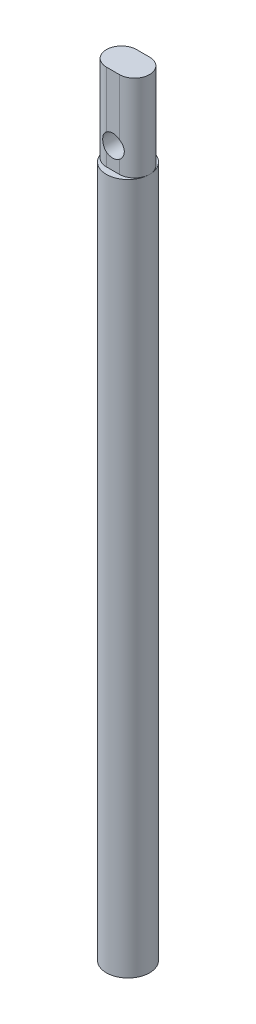
ISO-10303-21;
HEADER;
FILE_DESCRIPTION(('STEP AP214'),'2;1');
FILE_NAME('part.step','',(''),(''),'','','');
FILE_SCHEMA(('AUTOMOTIVE_DESIGN { 1 0 10303 214 1 1 1 1 }'));
ENDSEC;
DATA;
#1=APPLICATION_CONTEXT('core data for automotive mechanical design processes');
#2=APPLICATION_PROTOCOL_DEFINITION('international standard','automotive_design',2000,#1);
#3=PRODUCT_CONTEXT('',#1,'mechanical');
#4=PRODUCT('Part','Part','',(#3));
#5=PRODUCT_RELATED_PRODUCT_CATEGORY('part','',(#4));
#6=PRODUCT_DEFINITION_FORMATION('','',#4);
#7=PRODUCT_DEFINITION_CONTEXT('part definition',#1,'design');
#8=PRODUCT_DEFINITION('design','',#6,#7);
#9=PRODUCT_DEFINITION_SHAPE('','',#8);
#10=(LENGTH_UNIT() NAMED_UNIT(*) SI_UNIT(.MILLI.,.METRE.));
#11=(NAMED_UNIT(*) PLANE_ANGLE_UNIT() SI_UNIT($,.RADIAN.));
#12=(NAMED_UNIT(*) SI_UNIT($,.STERADIAN.) SOLID_ANGLE_UNIT());
#13=UNCERTAINTY_MEASURE_WITH_UNIT(LENGTH_MEASURE(1.E-05),#10,'distance_accuracy_value','');
#14=(GEOMETRIC_REPRESENTATION_CONTEXT(3) GLOBAL_UNCERTAINTY_ASSIGNED_CONTEXT((#13)) GLOBAL_UNIT_ASSIGNED_CONTEXT((#10,
#11,#12)) REPRESENTATION_CONTEXT('',''));
#15=CARTESIAN_POINT('',(0.,0.,0.));
#16=DIRECTION('',(0.,0.,1.));
#17=DIRECTION('',(1.,0.,0.));
#18=AXIS2_PLACEMENT_3D('',#15,#16,#17);
#19=CARTESIAN_POINT('',(1.5,180.,-3.5));
#20=DIRECTION('',(0.,0.,1.));
#21=DIRECTION('',(1.,0.,0.));
#22=AXIS2_PLACEMENT_3D('',#19,#20,#21);
#23=PLANE('',#22);
#24=DIRECTION('',(0.,-1.,0.));
#25=VECTOR('',#24,1.);
#26=CARTESIAN_POINT('',(1.5,180.,-3.5));
#27=LINE('',#26,#25);
#28=CARTESIAN_POINT('',(1.5,180.,-3.5));
#29=VERTEX_POINT('',#28);
#30=CARTESIAN_POINT('',(1.5,167.,-3.5));
#31=VERTEX_POINT('',#30);
#32=EDGE_CURVE('E153',#29,#31,#27,.T.);
#33=ORIENTED_EDGE('',*,*,#32,.T.);
#34=CARTESIAN_POINT('',(0.,165.,-3.5));
#35=DIRECTION('',(0.,0.,1.));
#36=DIRECTION('',(1.,0.,0.));
#37=AXIS2_PLACEMENT_3D('',#34,#35,#36);
#38=CIRCLE('',#37,2.5);
#39=CARTESIAN_POINT('',(-1.5,167.,-3.5));
#40=VERTEX_POINT('',#39);
#41=EDGE_CURVE('E250',#31,#40,#38,.T.);
#42=ORIENTED_EDGE('',*,*,#41,.T.);
#43=DIRECTION('',(0.,-1.,0.));
#44=VECTOR('',#43,1.);
#45=CARTESIAN_POINT('',(-1.5,180.,-3.5));
#46=LINE('',#45,#44);
#47=CARTESIAN_POINT('',(-1.5,180.,-3.5));
#48=VERTEX_POINT('',#47);
#49=EDGE_CURVE('E148',#48,#40,#46,.T.);
#50=ORIENTED_EDGE('',*,*,#49,.F.);
#51=DIRECTION('',(-1.,0.,0.));
#52=VECTOR('',#51,1.);
#53=CARTESIAN_POINT('',(1.5,180.,-3.5));
#54=LINE('',#53,#52);
#55=EDGE_CURVE('E200',#29,#48,#54,.T.);
#56=ORIENTED_EDGE('',*,*,#55,.F.);
#57=EDGE_LOOP('',(#33,#42,#50,#56));
#58=FACE_BOUND('',#57,.T.);
#59=ADVANCED_FACE('F39',(#58),#23,.F.);
#60=CARTESIAN_POINT('',(1.5,180.,3.5));
#61=DIRECTION('',(0.,0.,-1.));
#62=DIRECTION('',(-1.,0.,0.));
#63=AXIS2_PLACEMENT_3D('',#60,#61,#62);
#64=PLANE('',#63);
#65=DIRECTION('',(0.,-1.,0.));
#66=VECTOR('',#65,1.);
#67=CARTESIAN_POINT('',(-1.5,180.,3.5));
#68=LINE('',#67,#66);
#69=CARTESIAN_POINT('',(-1.5,180.,3.5));
#70=VERTEX_POINT('',#69);
#71=CARTESIAN_POINT('',(-1.5,167.,3.5));
#72=VERTEX_POINT('',#71);
#73=EDGE_CURVE('E127',#70,#72,#68,.T.);
#74=ORIENTED_EDGE('',*,*,#73,.T.);
#75=CARTESIAN_POINT('',(0.,165.,3.5));
#76=DIRECTION('',(0.,0.,1.));
#77=DIRECTION('',(1.,0.,0.));
#78=AXIS2_PLACEMENT_3D('',#75,#76,#77);
#79=CIRCLE('',#78,2.5);
#80=CARTESIAN_POINT('',(1.5,167.,3.5));
#81=VERTEX_POINT('',#80);
#82=EDGE_CURVE('E111',#81,#72,#79,.T.);
#83=ORIENTED_EDGE('',*,*,#82,.F.);
#84=DIRECTION('',(0.,-1.,0.));
#85=VECTOR('',#84,1.);
#86=CARTESIAN_POINT('',(1.5,180.,3.5));
#87=LINE('',#86,#85);
#88=CARTESIAN_POINT('',(1.5,180.,3.5));
#89=VERTEX_POINT('',#88);
#90=EDGE_CURVE('E124',#89,#81,#87,.T.);
#91=ORIENTED_EDGE('',*,*,#90,.F.);
#92=DIRECTION('',(1.,0.,0.));
#93=VECTOR('',#92,1.);
#94=CARTESIAN_POINT('',(1.5,180.,3.5));
#95=LINE('',#94,#93);
#96=EDGE_CURVE('E141',#70,#89,#95,.T.);
#97=ORIENTED_EDGE('',*,*,#96,.F.);
#98=EDGE_LOOP('',(#74,#83,#91,#97));
#99=FACE_BOUND('',#98,.T.);
#100=ADVANCED_FACE('F122',(#99),#64,.F.);
#101=CARTESIAN_POINT('',(0.,160.,0.));
#102=DIRECTION('',(0.,1.,0.));
#103=DIRECTION('',(0.,0.,1.));
#104=AXIS2_PLACEMENT_3D('',#101,#102,#103);
#105=PLANE('',#104);
#106=DIRECTION('',(1.,0.,0.));
#107=VECTOR('',#106,1.);
#108=CARTESIAN_POINT('',(1.5,160.,3.5));
#109=LINE('',#108,#107);
#110=CARTESIAN_POINT('',(-1.5,160.,3.5));
#111=VERTEX_POINT('',#110);
#112=CARTESIAN_POINT('',(1.5,160.,3.5));
#113=VERTEX_POINT('',#112);
#114=EDGE_CURVE('E143',#111,#113,#109,.T.);
#115=ORIENTED_EDGE('',*,*,#114,.F.);
#116=CARTESIAN_POINT('',(-1.5,160.,0.));
#117=DIRECTION('',(0.,1.,0.));
#118=DIRECTION('',(0.,0.,1.));
#119=AXIS2_PLACEMENT_3D('',#116,#117,#118);
#120=CIRCLE('',#119,3.5);
#121=CARTESIAN_POINT('',(-5.,160.,0.));
#122=VERTEX_POINT('',#121);
#123=EDGE_CURVE('E48',#122,#111,#120,.T.);
#124=ORIENTED_EDGE('',*,*,#123,.F.);
#125=CARTESIAN_POINT('',(0.,160.,0.));
#126=DIRECTION('',(0.,1.,0.));
#127=DIRECTION('',(0.,0.,1.));
#128=AXIS2_PLACEMENT_3D('',#125,#126,#127);
#129=CIRCLE('',#128,5.);
#130=CARTESIAN_POINT('',(5.,160.,0.));
#131=VERTEX_POINT('',#130);
#132=EDGE_CURVE('E162',#122,#131,#129,.T.);
#133=ORIENTED_EDGE('',*,*,#132,.T.);
#134=CARTESIAN_POINT('',(1.5,160.,0.));
#135=DIRECTION('',(0.,1.,0.));
#136=DIRECTION('',(0.,0.,1.));
#137=AXIS2_PLACEMENT_3D('',#134,#135,#136);
#138=CIRCLE('',#137,3.5);
#139=EDGE_CURVE('E116',#113,#131,#138,.T.);
#140=ORIENTED_EDGE('',*,*,#139,.F.);
#141=EDGE_LOOP('',(#115,#124,#133,#140));
#142=FACE_BOUND('',#141,.T.);
#143=ADVANCED_FACE('F174',(#142),#105,.T.);
#144=CARTESIAN_POINT('',(0.,160.,0.));
#145=DIRECTION('',(0.,-1.,0.));
#146=DIRECTION('',(0.,0.,-1.));
#147=AXIS2_PLACEMENT_3D('',#144,#145,#146);
#148=CYLINDRICAL_SURFACE('',#147,5.);
#149=EDGE_CURVE('E158',#131,#122,#129,.T.);
#150=ORIENTED_EDGE('',*,*,#149,.F.);
#151=ORIENTED_EDGE('',*,*,#132,.F.);
#152=EDGE_LOOP('',(#150,#151));
#153=FACE_BOUND('',#152,.T.);
#154=CARTESIAN_POINT('',(0.,0.,0.));
#155=DIRECTION('',(0.,1.,0.));
#156=DIRECTION('',(0.,0.,1.));
#157=AXIS2_PLACEMENT_3D('',#154,#155,#156);
#158=CIRCLE('',#157,5.);
#159=CARTESIAN_POINT('',(0.,0.,5.));
#160=VERTEX_POINT('',#159);
#161=EDGE_CURVE('E157',#160,#160,#158,.T.);
#162=ORIENTED_EDGE('',*,*,#161,.T.);
#163=EDGE_LOOP('',(#162));
#164=FACE_BOUND('',#163,.T.);
#165=ADVANCED_FACE('F41',(#153,#164),#148,.T.);
#166=CARTESIAN_POINT('',(1.5,160.,-3.5));
#167=VERTEX_POINT('',#166);
#168=EDGE_CURVE('E161',#131,#167,#138,.T.);
#169=ORIENTED_EDGE('',*,*,#168,.F.);
#170=ORIENTED_EDGE('',*,*,#149,.T.);
#171=CARTESIAN_POINT('',(-1.5,160.,-3.5));
#172=VERTEX_POINT('',#171);
#173=EDGE_CURVE('E189',#172,#122,#120,.T.);
#174=ORIENTED_EDGE('',*,*,#173,.F.);
#175=DIRECTION('',(-1.,0.,0.));
#176=VECTOR('',#175,1.);
#177=CARTESIAN_POINT('',(1.5,160.,-3.5));
#178=LINE('',#177,#176);
#179=EDGE_CURVE('E185',#167,#172,#178,.T.);
#180=ORIENTED_EDGE('',*,*,#179,.F.);
#181=EDGE_LOOP('',(#169,#170,#174,#180));
#182=FACE_BOUND('',#181,.T.);
#183=ADVANCED_FACE('F256',(#182),#105,.T.);
#184=CARTESIAN_POINT('',(0.,0.,0.));
#185=DIRECTION('',(0.,1.,0.));
#186=DIRECTION('',(0.,0.,1.));
#187=AXIS2_PLACEMENT_3D('',#184,#185,#186);
#188=PLANE('',#187);
#189=ORIENTED_EDGE('',*,*,#161,.F.);
#190=EDGE_LOOP('',(#189));
#191=FACE_BOUND('',#190,.T.);
#192=ADVANCED_FACE('F255',(#191),#188,.F.);
#193=CARTESIAN_POINT('',(1.5,180.,0.));
#194=DIRECTION('',(0.,-1.,0.));
#195=DIRECTION('',(0.,0.,-1.));
#196=AXIS2_PLACEMENT_3D('',#193,#194,#195);
#197=CYLINDRICAL_SURFACE('',#196,3.5);
#198=ORIENTED_EDGE('',*,*,#90,.T.);
#199=CARTESIAN_POINT('',(1.5,167.,3.5));
#200=CARTESIAN_POINT('',(1.55550799347548,166.958371955028,3.50000182403295));
#201=CARTESIAN_POINT('',(1.60923870833891,166.914458829327,3.49867944525516));
#202=CARTESIAN_POINT('',(1.71279062055591,166.822400967234,3.49390928275372));
#203=CARTESIAN_POINT('',(1.76261405184149,166.77425868268,3.49046272363378));
#204=CARTESIAN_POINT('',(1.90556669638333,166.624148110172,3.47773704351073));
#205=CARTESIAN_POINT('',(1.99243454591589,166.516303187899,3.46606714779262));
#206=CARTESIAN_POINT('',(2.14697715547835,166.288205808524,3.44057754469779));
#207=CARTESIAN_POINT('',(2.21467805357325,166.167970556565,3.42676080522302));
#208=CARTESIAN_POINT('',(2.32948955422714,165.917824435633,3.40079705982798));
#209=CARTESIAN_POINT('',(2.37659841645206,165.787912749944,3.38865019509646));
#210=CARTESIAN_POINT('',(2.44966264627943,165.518691121801,3.36892129127617));
#211=CARTESIAN_POINT('',(2.47511093269614,165.379234388802,3.36144970887882));
#212=CARTESIAN_POINT('',(2.50207601382924,165.097850622895,3.35351356506441));
#213=CARTESIAN_POINT('',(2.50360081172963,164.955924432007,3.35304666035744));
#214=CARTESIAN_POINT('',(2.48310534227236,164.679668593424,3.35910651510825));
#215=CARTESIAN_POINT('',(2.46202161731984,164.545261715496,3.36535511270281));
#216=CARTESIAN_POINT('',(2.3984746322049,164.281888670005,3.38287085396033));
#217=CARTESIAN_POINT('',(2.35599929615826,164.152925620181,3.39414083185271));
#218=CARTESIAN_POINT('',(2.25009827301547,163.90185719573,3.4191146982783));
#219=CARTESIAN_POINT('',(2.18636318784528,163.779886273712,3.43285305993864));
#220=CARTESIAN_POINT('',(2.03973449354263,163.5480174572,3.45893078315556));
#221=CARTESIAN_POINT('',(1.95686451906038,163.438104913722,3.47127184280615));
#222=CARTESIAN_POINT('',(1.81037063918459,163.273901514522,3.48665088787467));
#223=CARTESIAN_POINT('',(1.75217828172463,163.21485966106,3.4914370119411));
#224=CARTESIAN_POINT('',(1.63017169840649,163.102789377352,3.49811293680924));
#225=CARTESIAN_POINT('',(1.56636009880838,163.049758164146,3.50000408311605));
#226=CARTESIAN_POINT('',(1.50000000000001,163.,3.5));
#227=B_SPLINE_CURVE_WITH_KNOTS('',3,(#199,#200,#201,#202,#203,#204,#205,#206,#207,#208,#209,
#210,#211,#212,#213,#214,#215,#216,#217,#218,#219,#220,#221,#222,#223,#224,#225,#226),
.UNSPECIFIED.,.F.,.F.,(4,2,2,2,2,2,2,2,2,2,2,2,2,4),(0.,0.207986641866063,0.415853490103764,
0.830637802639141,1.24485371679656,1.65910463160949,2.0828056660256,2.50636495565969,
2.91303287689119,3.31993062600178,3.73302908161793,4.14561999843524,4.39431324513266,
4.64289087099999),.UNSPECIFIED.);
#228=CARTESIAN_POINT('',(1.5,163.,3.5));
#229=VERTEX_POINT('',#228);
#230=EDGE_CURVE('E108',#81,#229,#227,.T.);
#231=ORIENTED_EDGE('',*,*,#230,.T.);
#232=EDGE_CURVE('E136',#229,#113,#87,.T.);
#233=ORIENTED_EDGE('',*,*,#232,.T.);
#234=ORIENTED_EDGE('',*,*,#139,.T.);
#235=ORIENTED_EDGE('',*,*,#168,.T.);
#236=CARTESIAN_POINT('',(1.5,163.,-3.5));
#237=VERTEX_POINT('',#236);
#238=EDGE_CURVE('E152',#237,#167,#27,.T.);
#239=ORIENTED_EDGE('',*,*,#238,.F.);
#240=CARTESIAN_POINT('',(1.5,163.,-3.5));
#241=CARTESIAN_POINT('',(1.55550799347548,163.041628044972,-3.50000182403295));
#242=CARTESIAN_POINT('',(1.60923870833891,163.085541170673,-3.49867944525516));
#243=CARTESIAN_POINT('',(1.71279062055591,163.177599032766,-3.49390928275372));
#244=CARTESIAN_POINT('',(1.76261405184149,163.22574131732,-3.49046272363378));
#245=CARTESIAN_POINT('',(1.90556669638333,163.375851889828,-3.47773704351073));
#246=CARTESIAN_POINT('',(1.99243454591589,163.483696812101,-3.46606714779262));
#247=CARTESIAN_POINT('',(2.14697715547835,163.711794191476,-3.44057754469779));
#248=CARTESIAN_POINT('',(2.21467805357325,163.832029443435,-3.42676080522303));
#249=CARTESIAN_POINT('',(2.32948955422714,164.082175564367,-3.40079705982798));
#250=CARTESIAN_POINT('',(2.37659841645206,164.212087250056,-3.38865019509646));
#251=CARTESIAN_POINT('',(2.44966264627943,164.481308878199,-3.36892129127617));
#252=CARTESIAN_POINT('',(2.47511093269614,164.620765611198,-3.36144970887882));
#253=CARTESIAN_POINT('',(2.50207601382924,164.902149377105,-3.35351356506442));
#254=CARTESIAN_POINT('',(2.50360081172963,165.044075567993,-3.35304666035744));
#255=CARTESIAN_POINT('',(2.48310534227236,165.320331406576,-3.35910651510825));
#256=CARTESIAN_POINT('',(2.46202161731984,165.454738284504,-3.36535511270281));
#257=CARTESIAN_POINT('',(2.3984746322049,165.718111329995,-3.38287085396033));
#258=CARTESIAN_POINT('',(2.35599929615826,165.847074379819,-3.39414083185271));
#259=CARTESIAN_POINT('',(2.25009827301547,166.09814280427,-3.4191146982783));
#260=CARTESIAN_POINT('',(2.18636318784528,166.220113726288,-3.43285305993864));
#261=CARTESIAN_POINT('',(2.03973449354263,166.4519825428,-3.45893078315557));
#262=CARTESIAN_POINT('',(1.95686451906038,166.561895086278,-3.47127184280615));
#263=CARTESIAN_POINT('',(1.81037063918459,166.726098485478,-3.48665088787467));
#264=CARTESIAN_POINT('',(1.75217828172463,166.78514033894,-3.4914370119411));
#265=CARTESIAN_POINT('',(1.63017169840649,166.897210622648,-3.49811293680924));
#266=CARTESIAN_POINT('',(1.56636009880838,166.950241835854,-3.50000408311605));
#267=CARTESIAN_POINT('',(1.50000000000001,167.,-3.5));
#268=B_SPLINE_CURVE_WITH_KNOTS('',3,(#240,#241,#242,#243,#244,#245,#246,#247,#248,#249,#250,
#251,#252,#253,#254,#255,#256,#257,#258,#259,#260,#261,#262,#263,#264,#265,#266,#267),
.UNSPECIFIED.,.F.,.F.,(4,2,2,2,2,2,2,2,2,2,2,2,2,4),(0.,0.207986641866063,0.415853490103763,
0.83063780263914,1.24485371679656,1.65910463160949,2.0828056660256,2.50636495565969,
2.91303287689119,3.31993062600178,3.73302908161793,4.14561999843524,4.39431324513266,
4.64289087099999),.UNSPECIFIED.);
#269=EDGE_CURVE('E117',#237,#31,#268,.T.);
#270=ORIENTED_EDGE('',*,*,#269,.T.);
#271=ORIENTED_EDGE('',*,*,#32,.F.);
#272=CARTESIAN_POINT('',(1.5,180.,0.));
#273=DIRECTION('',(0.,1.,0.));
#274=DIRECTION('',(0.,0.,1.));
#275=AXIS2_PLACEMENT_3D('',#272,#273,#274);
#276=CIRCLE('',#275,3.5);
#277=EDGE_CURVE('E133',#89,#29,#276,.T.);
#278=ORIENTED_EDGE('',*,*,#277,.F.);
#279=EDGE_LOOP('',(#198,#231,#233,#234,#235,#239,#270,#271,#278));
#280=FACE_BOUND('',#279,.T.);
#281=ADVANCED_FACE('F130',(#280),#197,.T.);
#282=CARTESIAN_POINT('',(-1.5,163.,-3.5));
#283=VERTEX_POINT('',#282);
#284=EDGE_CURVE('E147',#283,#172,#46,.T.);
#285=ORIENTED_EDGE('',*,*,#284,.F.);
#286=EDGE_CURVE('E55',#283,#237,#38,.T.);
#287=ORIENTED_EDGE('',*,*,#286,.T.);
#288=ORIENTED_EDGE('',*,*,#238,.T.);
#289=ORIENTED_EDGE('',*,*,#179,.T.);
#290=EDGE_LOOP('',(#285,#287,#288,#289));
#291=FACE_BOUND('',#290,.T.);
#292=ADVANCED_FACE('F254',(#291),#23,.F.);
#293=CARTESIAN_POINT('',(-1.5,180.,0.));
#294=DIRECTION('',(0.,-1.,0.));
#295=DIRECTION('',(0.,0.,-1.));
#296=AXIS2_PLACEMENT_3D('',#293,#294,#295);
#297=CYLINDRICAL_SURFACE('',#296,3.5);
#298=ORIENTED_EDGE('',*,*,#49,.T.);
#299=CARTESIAN_POINT('',(-1.5,167.,-3.5));
#300=CARTESIAN_POINT('',(-1.55550799347548,166.958371955028,-3.50000182403295));
#301=CARTESIAN_POINT('',(-1.60923870833891,166.914458829327,-3.49867944525516));
#302=CARTESIAN_POINT('',(-1.71279062055592,166.822400967234,-3.49390928275372));
#303=CARTESIAN_POINT('',(-1.76261405184149,166.77425868268,-3.49046272363378));
#304=CARTESIAN_POINT('',(-1.90556669638333,166.624148110172,-3.47773704351073));
#305=CARTESIAN_POINT('',(-1.99243454591589,166.516303187899,-3.46606714779262));
#306=CARTESIAN_POINT('',(-2.14697715547835,166.288205808524,-3.44057754469779));
#307=CARTESIAN_POINT('',(-2.21467805357326,166.167970556564,-3.42676080522302));
#308=CARTESIAN_POINT('',(-2.32948955422714,165.917824435633,-3.40079705982798));
#309=CARTESIAN_POINT('',(-2.37659841645206,165.787912749944,-3.38865019509646));
#310=CARTESIAN_POINT('',(-2.44966264627943,165.518691121801,-3.36892129127617));
#311=CARTESIAN_POINT('',(-2.47511093269614,165.379234388802,-3.36144970887882));
#312=CARTESIAN_POINT('',(-2.50207601382924,165.097850622895,-3.35351356506441));
#313=CARTESIAN_POINT('',(-2.50360081172963,164.955924432007,-3.35304666035744));
#314=CARTESIAN_POINT('',(-2.48310534227236,164.679668593424,-3.35910651510825));
#315=CARTESIAN_POINT('',(-2.46202161731985,164.545261715496,-3.36535511270281));
#316=CARTESIAN_POINT('',(-2.3984746322049,164.281888670005,-3.38287085396033));
#317=CARTESIAN_POINT('',(-2.35599929615826,164.152925620181,-3.39414083185271));
#318=CARTESIAN_POINT('',(-2.25009827301547,163.90185719573,-3.4191146982783));
#319=CARTESIAN_POINT('',(-2.18636318784528,163.779886273712,-3.43285305993864));
#320=CARTESIAN_POINT('',(-2.03973449354263,163.5480174572,-3.45893078315557));
#321=CARTESIAN_POINT('',(-1.95686451906038,163.438104913722,-3.47127184280615));
#322=CARTESIAN_POINT('',(-1.81037063918459,163.273901514522,-3.48665088787467));
#323=CARTESIAN_POINT('',(-1.75217828172463,163.21485966106,-3.4914370119411));
#324=CARTESIAN_POINT('',(-1.63017169840649,163.102789377352,-3.49811293680924));
#325=CARTESIAN_POINT('',(-1.56636009880839,163.049758164146,-3.50000408311605));
#326=CARTESIAN_POINT('',(-1.50000000000001,163.,-3.5));
#327=B_SPLINE_CURVE_WITH_KNOTS('',3,(#299,#300,#301,#302,#303,#304,#305,#306,#307,#308,#309,
#310,#311,#312,#313,#314,#315,#316,#317,#318,#319,#320,#321,#322,#323,#324,#325,#326),
.UNSPECIFIED.,.F.,.F.,(4,2,2,2,2,2,2,2,2,2,2,2,2,4),(0.,0.207986641866064,0.415853490103765,
0.830637802639142,1.24485371679659,1.65910463160949,2.0828056660256,2.50636495565969,
2.91303287689119,3.31993062600178,3.73302908161793,4.14561999843524,4.39431324513266,
4.64289087099999),.UNSPECIFIED.);
#328=EDGE_CURVE('E221',#40,#283,#327,.T.);
#329=ORIENTED_EDGE('',*,*,#328,.T.);
#330=ORIENTED_EDGE('',*,*,#284,.T.);
#331=ORIENTED_EDGE('',*,*,#173,.T.);
#332=ORIENTED_EDGE('',*,*,#123,.T.);
#333=CARTESIAN_POINT('',(-1.5,163.,3.5));
#334=VERTEX_POINT('',#333);
#335=EDGE_CURVE('E135',#334,#111,#68,.T.);
#336=ORIENTED_EDGE('',*,*,#335,.F.);
#337=CARTESIAN_POINT('',(-1.5,163.,3.5));
#338=CARTESIAN_POINT('',(-1.55550799347548,163.041628044972,3.50000182403295));
#339=CARTESIAN_POINT('',(-1.60923870833891,163.085541170673,3.49867944525516));
#340=CARTESIAN_POINT('',(-1.71279062055592,163.177599032766,3.49390928275372));
#341=CARTESIAN_POINT('',(-1.76261405184149,163.22574131732,3.49046272363378));
#342=CARTESIAN_POINT('',(-1.90556669638333,163.375851889828,3.47773704351073));
#343=CARTESIAN_POINT('',(-1.99243454591589,163.483696812101,3.46606714779262));
#344=CARTESIAN_POINT('',(-2.14697715547835,163.711794191476,3.44057754469779));
#345=CARTESIAN_POINT('',(-2.21467805357325,163.832029443435,3.42676080522302));
#346=CARTESIAN_POINT('',(-2.32948955422714,164.082175564367,3.40079705982798));
#347=CARTESIAN_POINT('',(-2.37659841645206,164.212087250056,3.38865019509646));
#348=CARTESIAN_POINT('',(-2.44966264627943,164.481308878199,3.36892129127617));
#349=CARTESIAN_POINT('',(-2.47511093269614,164.620765611198,3.36144970887882));
#350=CARTESIAN_POINT('',(-2.50207601382924,164.902149377105,3.35351356506441));
#351=CARTESIAN_POINT('',(-2.50360081172963,165.044075567993,3.35304666035744));
#352=CARTESIAN_POINT('',(-2.48310534227236,165.320331406576,3.35910651510825));
#353=CARTESIAN_POINT('',(-2.46202161731984,165.454738284504,3.36535511270281));
#354=CARTESIAN_POINT('',(-2.3984746322049,165.718111329995,3.38287085396033));
#355=CARTESIAN_POINT('',(-2.35599929615826,165.847074379819,3.39414083185271));
#356=CARTESIAN_POINT('',(-2.25009827301547,166.09814280427,3.4191146982783));
#357=CARTESIAN_POINT('',(-2.18636318784528,166.220113726288,3.43285305993864));
#358=CARTESIAN_POINT('',(-2.03973449354263,166.4519825428,3.45893078315557));
#359=CARTESIAN_POINT('',(-1.95686451906038,166.561895086278,3.47127184280615));
#360=CARTESIAN_POINT('',(-1.81037063918459,166.726098485478,3.48665088787467));
#361=CARTESIAN_POINT('',(-1.75217828172463,166.78514033894,3.4914370119411));
#362=CARTESIAN_POINT('',(-1.63017169840649,166.897210622648,3.49811293680924));
#363=CARTESIAN_POINT('',(-1.56636009880839,166.950241835854,3.50000408311605));
#364=CARTESIAN_POINT('',(-1.50000000000001,167.,3.5));
#365=B_SPLINE_CURVE_WITH_KNOTS('',3,(#337,#338,#339,#340,#341,#342,#343,#344,#345,#346,#347,
#348,#349,#350,#351,#352,#353,#354,#355,#356,#357,#358,#359,#360,#361,#362,#363,#364),
.UNSPECIFIED.,.F.,.F.,(4,2,2,2,2,2,2,2,2,2,2,2,2,4),(0.,0.207986641866065,0.415853490103766,
0.830637802639143,1.24485371679656,1.65910463160949,2.0828056660256,2.50636495565969,
2.9130328768912,3.31993062600178,3.73302908161793,4.14561999843525,4.39431324513266,
4.64289087099999),.UNSPECIFIED.);
#366=EDGE_CURVE('E63',#334,#72,#365,.T.);
#367=ORIENTED_EDGE('',*,*,#366,.T.);
#368=ORIENTED_EDGE('',*,*,#73,.F.);
#369=CARTESIAN_POINT('',(-1.5,180.,0.));
#370=DIRECTION('',(0.,1.,0.));
#371=DIRECTION('',(0.,0.,1.));
#372=AXIS2_PLACEMENT_3D('',#369,#370,#371);
#373=CIRCLE('',#372,3.5);
#374=EDGE_CURVE('E204',#48,#70,#373,.T.);
#375=ORIENTED_EDGE('',*,*,#374,.F.);
#376=EDGE_LOOP('',(#298,#329,#330,#331,#332,#336,#367,#368,#375));
#377=FACE_BOUND('',#376,.T.);
#378=ADVANCED_FACE('F219',(#377),#297,.T.);
#379=ORIENTED_EDGE('',*,*,#232,.F.);
#380=CARTESIAN_POINT('',(0.,165.,3.5));
#381=DIRECTION('',(0.,0.,-1.));
#382=DIRECTION('',(-1.,0.,0.));
#383=AXIS2_PLACEMENT_3D('',#380,#381,#382);
#384=CIRCLE('',#383,2.5);
#385=EDGE_CURVE('E11',#229,#334,#384,.T.);
#386=ORIENTED_EDGE('',*,*,#385,.T.);
#387=ORIENTED_EDGE('',*,*,#335,.T.);
#388=ORIENTED_EDGE('',*,*,#114,.T.);
#389=EDGE_LOOP('',(#379,#386,#387,#388));
#390=FACE_BOUND('',#389,.T.);
#391=ADVANCED_FACE('F268',(#390),#64,.F.);
#392=CARTESIAN_POINT('',(1.5,180.,0.));
#393=DIRECTION('',(0.,1.,0.));
#394=DIRECTION('',(0.,0.,1.));
#395=AXIS2_PLACEMENT_3D('',#392,#393,#394);
#396=PLANE('',#395);
#397=ORIENTED_EDGE('',*,*,#277,.T.);
#398=ORIENTED_EDGE('',*,*,#55,.T.);
#399=ORIENTED_EDGE('',*,*,#374,.T.);
#400=ORIENTED_EDGE('',*,*,#96,.T.);
#401=EDGE_LOOP('',(#397,#398,#399,#400));
#402=FACE_BOUND('',#401,.T.);
#403=ADVANCED_FACE('F216',(#402),#396,.T.);
#404=CARTESIAN_POINT('',(0.,165.,-6.5));
#405=DIRECTION('',(0.,0.,1.));
#406=DIRECTION('',(1.,0.,0.));
#407=AXIS2_PLACEMENT_3D('',#404,#405,#406);
#408=CYLINDRICAL_SURFACE('',#407,2.5);
#409=ORIENTED_EDGE('',*,*,#286,.F.);
#410=ORIENTED_EDGE('',*,*,#328,.F.);
#411=ORIENTED_EDGE('',*,*,#41,.F.);
#412=ORIENTED_EDGE('',*,*,#269,.F.);
#413=EDGE_LOOP('',(#409,#410,#411,#412));
#414=FACE_BOUND('',#413,.T.);
#415=ORIENTED_EDGE('',*,*,#82,.T.);
#416=ORIENTED_EDGE('',*,*,#366,.F.);
#417=ORIENTED_EDGE('',*,*,#385,.F.);
#418=ORIENTED_EDGE('',*,*,#230,.F.);
#419=EDGE_LOOP('',(#415,#416,#417,#418));
#420=FACE_BOUND('',#419,.T.);
#421=ADVANCED_FACE('F110',(#414,#420),#408,.F.);
#422=CLOSED_SHELL('',(#59,#100,#143,#165,#183,#192,#281,#292,#378,#391,#403,#421));
#423=MANIFOLD_SOLID_BREP('B2',#422);
#424=ADVANCED_BREP_SHAPE_REPRESENTATION('',(#18,#423),#14);
#425=SHAPE_DEFINITION_REPRESENTATION(#9,#424);
ENDSEC;
END-ISO-10303-21;
